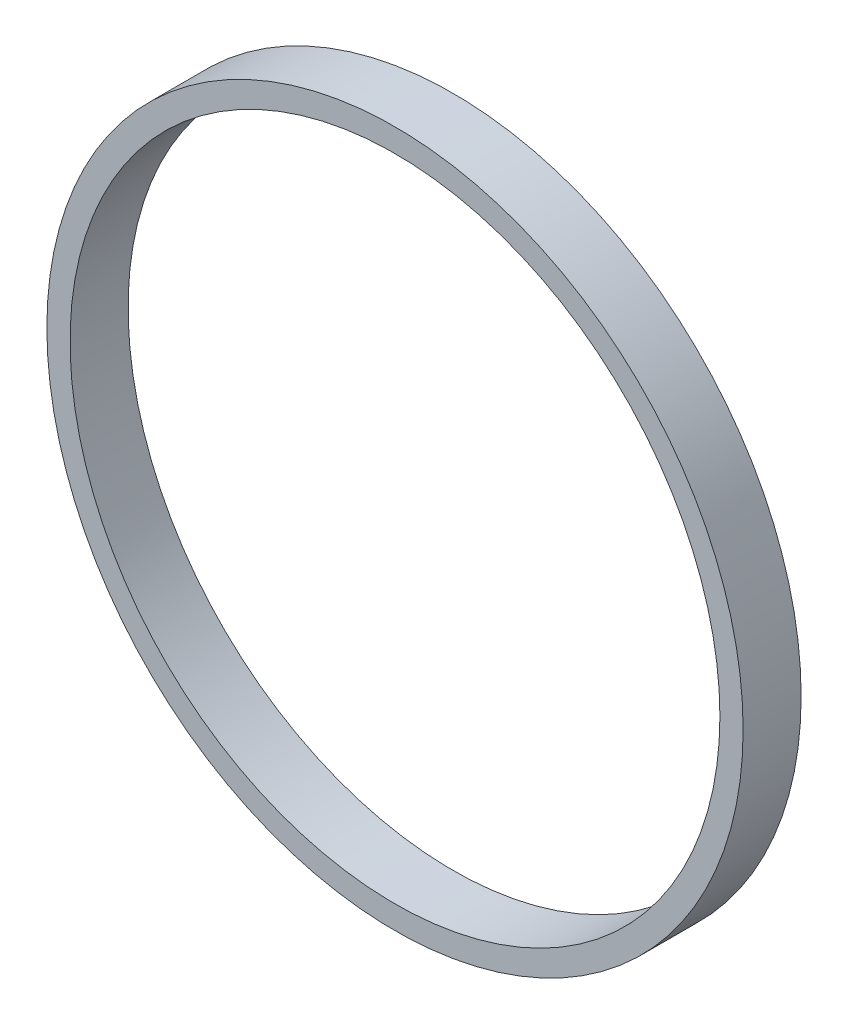
ISO-10303-21;
HEADER;
FILE_DESCRIPTION(('STEP AP214'),'2;1');
FILE_NAME('part.step','',(''),(''),'','','');
FILE_SCHEMA(('AUTOMOTIVE_DESIGN { 1 0 10303 214 1 1 1 1 }'));
ENDSEC;
DATA;
#1=APPLICATION_CONTEXT('core data for automotive mechanical design processes');
#2=APPLICATION_PROTOCOL_DEFINITION('international standard','automotive_design',2000,#1);
#3=PRODUCT_CONTEXT('',#1,'mechanical');
#4=PRODUCT('Part','Part','',(#3));
#5=PRODUCT_RELATED_PRODUCT_CATEGORY('part','',(#4));
#6=PRODUCT_DEFINITION_FORMATION('','',#4);
#7=PRODUCT_DEFINITION_CONTEXT('part definition',#1,'design');
#8=PRODUCT_DEFINITION('design','',#6,#7);
#9=PRODUCT_DEFINITION_SHAPE('','',#8);
#10=(LENGTH_UNIT() NAMED_UNIT(*) SI_UNIT(.MILLI.,.METRE.));
#11=(NAMED_UNIT(*) PLANE_ANGLE_UNIT() SI_UNIT($,.RADIAN.));
#12=(NAMED_UNIT(*) SI_UNIT($,.STERADIAN.) SOLID_ANGLE_UNIT());
#13=UNCERTAINTY_MEASURE_WITH_UNIT(LENGTH_MEASURE(1.E-05),#10,'distance_accuracy_value','');
#14=(GEOMETRIC_REPRESENTATION_CONTEXT(3) GLOBAL_UNCERTAINTY_ASSIGNED_CONTEXT((#13)) GLOBAL_UNIT_ASSIGNED_CONTEXT((#10,
#11,#12)) REPRESENTATION_CONTEXT('',''));
#15=CARTESIAN_POINT('',(0.,0.,0.));
#16=DIRECTION('',(0.,0.,1.));
#17=DIRECTION('',(1.,0.,0.));
#18=AXIS2_PLACEMENT_3D('',#15,#16,#17);
#19=CARTESIAN_POINT('',(0.,0.,5.));
#20=DIRECTION('',(0.,0.,1.));
#21=DIRECTION('',(1.,0.,0.));
#22=AXIS2_PLACEMENT_3D('',#19,#20,#21);
#23=PLANE('',#22);
#24=CARTESIAN_POINT('',(0.,0.,5.));
#25=DIRECTION('',(0.,0.,1.));
#26=DIRECTION('',(1.,0.,0.));
#27=AXIS2_PLACEMENT_3D('',#24,#25,#26);
#28=CIRCLE('',#27,30.);
#29=CARTESIAN_POINT('',(30.,0.,5.));
#30=VERTEX_POINT('',#29);
#31=EDGE_CURVE('E10',#30,#30,#28,.T.);
#32=ORIENTED_EDGE('',*,*,#31,.T.);
#33=EDGE_LOOP('',(#32));
#34=FACE_BOUND('',#33,.T.);
#35=CARTESIAN_POINT('',(0.,0.,5.));
#36=DIRECTION('',(0.,0.,1.));
#37=DIRECTION('',(1.,0.,0.));
#38=AXIS2_PLACEMENT_3D('',#35,#36,#37);
#39=CIRCLE('',#38,28.);
#40=CARTESIAN_POINT('',(28.,0.,5.));
#41=VERTEX_POINT('',#40);
#42=EDGE_CURVE('E50',#41,#41,#39,.T.);
#43=ORIENTED_EDGE('',*,*,#42,.F.);
#44=EDGE_LOOP('',(#43));
#45=FACE_BOUND('',#44,.T.);
#46=ADVANCED_FACE('F37',(#34,#45),#23,.T.);
#47=CARTESIAN_POINT('',(0.,0.,0.));
#48=DIRECTION('',(0.,0.,1.));
#49=DIRECTION('',(1.,0.,0.));
#50=AXIS2_PLACEMENT_3D('',#47,#48,#49);
#51=PLANE('',#50);
#52=CARTESIAN_POINT('',(0.,0.,0.));
#53=DIRECTION('',(0.,0.,1.));
#54=DIRECTION('',(1.,0.,0.));
#55=AXIS2_PLACEMENT_3D('',#52,#53,#54);
#56=CIRCLE('',#55,30.);
#57=CARTESIAN_POINT('',(30.,0.,0.));
#58=VERTEX_POINT('',#57);
#59=EDGE_CURVE('E41',#58,#58,#56,.T.);
#60=ORIENTED_EDGE('',*,*,#59,.F.);
#61=EDGE_LOOP('',(#60));
#62=FACE_BOUND('',#61,.T.);
#63=CARTESIAN_POINT('',(0.,0.,0.));
#64=DIRECTION('',(0.,0.,1.));
#65=DIRECTION('',(1.,0.,0.));
#66=AXIS2_PLACEMENT_3D('',#63,#64,#65);
#67=CIRCLE('',#66,28.);
#68=CARTESIAN_POINT('',(28.,0.,0.));
#69=VERTEX_POINT('',#68);
#70=EDGE_CURVE('E52',#69,#69,#67,.T.);
#71=ORIENTED_EDGE('',*,*,#70,.T.);
#72=EDGE_LOOP('',(#71));
#73=FACE_BOUND('',#72,.T.);
#74=ADVANCED_FACE('F64',(#62,#73),#51,.F.);
#75=CARTESIAN_POINT('',(0.,0.,5.));
#76=DIRECTION('',(0.,0.,-1.));
#77=DIRECTION('',(-1.,0.,0.));
#78=AXIS2_PLACEMENT_3D('',#75,#76,#77);
#79=CYLINDRICAL_SURFACE('',#78,30.);
#80=ORIENTED_EDGE('',*,*,#31,.F.);
#81=EDGE_LOOP('',(#80));
#82=FACE_BOUND('',#81,.T.);
#83=ORIENTED_EDGE('',*,*,#59,.T.);
#84=EDGE_LOOP('',(#83));
#85=FACE_BOUND('',#84,.T.);
#86=ADVANCED_FACE('F39',(#82,#85),#79,.T.);
#87=CARTESIAN_POINT('',(0.,0.,5.));
#88=DIRECTION('',(0.,0.,-1.));
#89=DIRECTION('',(-1.,0.,0.));
#90=AXIS2_PLACEMENT_3D('',#87,#88,#89);
#91=CYLINDRICAL_SURFACE('',#90,28.);
#92=ORIENTED_EDGE('',*,*,#42,.T.);
#93=EDGE_LOOP('',(#92));
#94=FACE_BOUND('',#93,.T.);
#95=ORIENTED_EDGE('',*,*,#70,.F.);
#96=EDGE_LOOP('',(#95));
#97=FACE_BOUND('',#96,.T.);
#98=ADVANCED_FACE('F60',(#94,#97),#91,.F.);
#99=CLOSED_SHELL('',(#46,#74,#86,#98));
#100=MANIFOLD_SOLID_BREP('B2',#99);
#101=ADVANCED_BREP_SHAPE_REPRESENTATION('',(#18,#100),#14);
#102=SHAPE_DEFINITION_REPRESENTATION(#9,#101);
ENDSEC;
END-ISO-10303-21;
